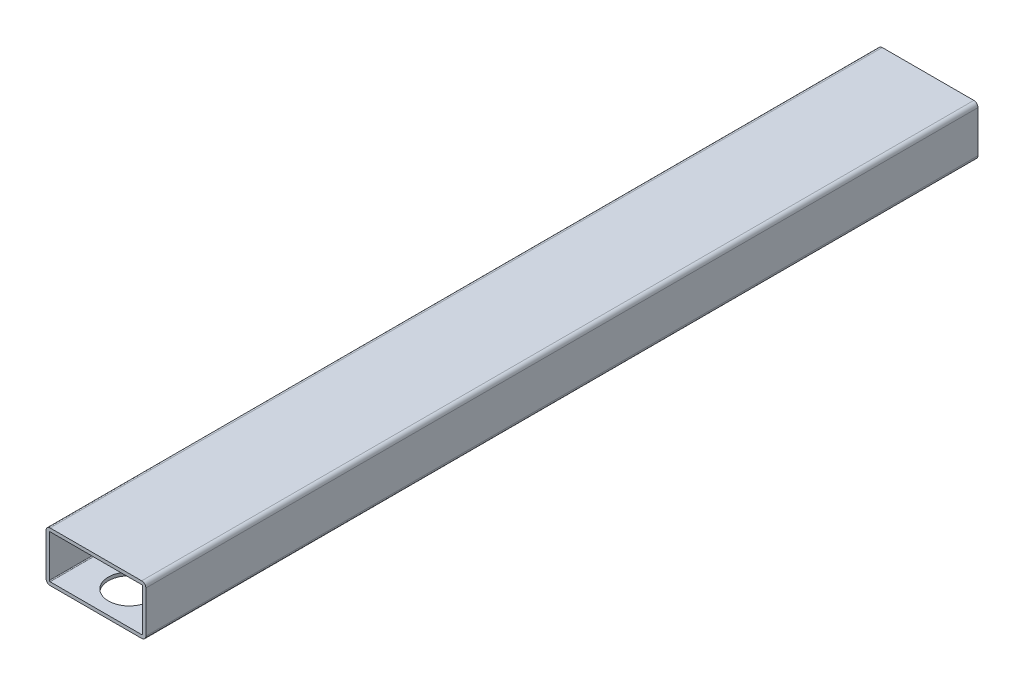
ISO-10303-21;
HEADER;
FILE_DESCRIPTION(('STEP AP214'),'2;1');
FILE_NAME('part.step','',(''),(''),'','','');
FILE_SCHEMA(('AUTOMOTIVE_DESIGN { 1 0 10303 214 1 1 1 1 }'));
ENDSEC;
DATA;
#1=APPLICATION_CONTEXT('core data for automotive mechanical design processes');
#2=APPLICATION_PROTOCOL_DEFINITION('international standard','automotive_design',2000,#1);
#3=PRODUCT_CONTEXT('',#1,'mechanical');
#4=PRODUCT('Part','Part','',(#3));
#5=PRODUCT_RELATED_PRODUCT_CATEGORY('part','',(#4));
#6=PRODUCT_DEFINITION_FORMATION('','',#4);
#7=PRODUCT_DEFINITION_CONTEXT('part definition',#1,'design');
#8=PRODUCT_DEFINITION('design','',#6,#7);
#9=PRODUCT_DEFINITION_SHAPE('','',#8);
#10=(LENGTH_UNIT() NAMED_UNIT(*) SI_UNIT(.MILLI.,.METRE.));
#11=(NAMED_UNIT(*) PLANE_ANGLE_UNIT() SI_UNIT($,.RADIAN.));
#12=(NAMED_UNIT(*) SI_UNIT($,.STERADIAN.) SOLID_ANGLE_UNIT());
#13=UNCERTAINTY_MEASURE_WITH_UNIT(LENGTH_MEASURE(1.E-05),#10,'distance_accuracy_value','');
#14=(GEOMETRIC_REPRESENTATION_CONTEXT(3) GLOBAL_UNCERTAINTY_ASSIGNED_CONTEXT((#13)) GLOBAL_UNIT_ASSIGNED_CONTEXT((#10,
#11,#12)) REPRESENTATION_CONTEXT('',''));
#15=CARTESIAN_POINT('',(0.,0.,0.));
#16=DIRECTION('',(0.,0.,1.));
#17=DIRECTION('',(1.,0.,0.));
#18=AXIS2_PLACEMENT_3D('',#15,#16,#17);
#19=CARTESIAN_POINT('',(55.,25.,1000.));
#20=DIRECTION('',(0.,0.,-1.));
#21=DIRECTION('',(-1.,0.,0.));
#22=AXIS2_PLACEMENT_3D('',#19,#20,#21);
#23=PLANE('',#22);
#24=CARTESIAN_POINT('',(55.,25.,1000.));
#25=DIRECTION('',(0.,0.,1.));
#26=DIRECTION('',(-1.,0.,0.));
#27=AXIS2_PLACEMENT_3D('',#24,#25,#26);
#28=CIRCLE('',#27,5.);
#29=CARTESIAN_POINT('',(60.,25.,1000.));
#30=VERTEX_POINT('',#29);
#31=CARTESIAN_POINT('',(55.,30.,1000.));
#32=VERTEX_POINT('',#31);
#33=EDGE_CURVE('E216',#30,#32,#28,.T.);
#34=ORIENTED_EDGE('',*,*,#33,.T.);
#35=DIRECTION('',(-1.,0.,0.));
#36=VECTOR('',#35,1.);
#37=CARTESIAN_POINT('',(-55.,30.,1000.));
#38=LINE('',#37,#36);
#39=CARTESIAN_POINT('',(-55.,30.,1000.));
#40=VERTEX_POINT('',#39);
#41=EDGE_CURVE('E219',#32,#40,#38,.T.);
#42=ORIENTED_EDGE('',*,*,#41,.T.);
#43=CARTESIAN_POINT('',(-55.,25.,1000.));
#44=DIRECTION('',(0.,0.,1.));
#45=DIRECTION('',(1.,0.,0.));
#46=AXIS2_PLACEMENT_3D('',#43,#44,#45);
#47=CIRCLE('',#46,5.);
#48=CARTESIAN_POINT('',(-60.,25.,1000.));
#49=VERTEX_POINT('',#48);
#50=EDGE_CURVE('E222',#40,#49,#47,.T.);
#51=ORIENTED_EDGE('',*,*,#50,.T.);
#52=DIRECTION('',(0.,-1.,0.));
#53=VECTOR('',#52,1.);
#54=CARTESIAN_POINT('',(-60.,25.,1000.));
#55=LINE('',#54,#53);
#56=CARTESIAN_POINT('',(-60.,-25.,1000.));
#57=VERTEX_POINT('',#56);
#58=EDGE_CURVE('E224',#49,#57,#55,.T.);
#59=ORIENTED_EDGE('',*,*,#58,.T.);
#60=CARTESIAN_POINT('',(-55.,-25.,1000.));
#61=DIRECTION('',(0.,0.,1.));
#62=DIRECTION('',(1.,0.,0.));
#63=AXIS2_PLACEMENT_3D('',#60,#61,#62);
#64=CIRCLE('',#63,5.);
#65=CARTESIAN_POINT('',(-55.,-30.,1000.));
#66=VERTEX_POINT('',#65);
#67=EDGE_CURVE('E226',#57,#66,#64,.T.);
#68=ORIENTED_EDGE('',*,*,#67,.T.);
#69=DIRECTION('',(1.,0.,0.));
#70=VECTOR('',#69,1.);
#71=CARTESIAN_POINT('',(-55.,-30.,1000.));
#72=LINE('',#71,#70);
#73=CARTESIAN_POINT('',(55.,-30.,1000.));
#74=VERTEX_POINT('',#73);
#75=EDGE_CURVE('E228',#66,#74,#72,.T.);
#76=ORIENTED_EDGE('',*,*,#75,.T.);
#77=CARTESIAN_POINT('',(55.,-25.,1000.));
#78=DIRECTION('',(0.,0.,1.));
#79=DIRECTION('',(1.,0.,0.));
#80=AXIS2_PLACEMENT_3D('',#77,#78,#79);
#81=CIRCLE('',#80,5.);
#82=CARTESIAN_POINT('',(60.,-25.,1000.));
#83=VERTEX_POINT('',#82);
#84=EDGE_CURVE('E230',#74,#83,#81,.T.);
#85=ORIENTED_EDGE('',*,*,#84,.T.);
#86=DIRECTION('',(0.,1.,0.));
#87=VECTOR('',#86,1.);
#88=CARTESIAN_POINT('',(60.,25.,1000.));
#89=LINE('',#88,#87);
#90=EDGE_CURVE('E232',#83,#30,#89,.T.);
#91=ORIENTED_EDGE('',*,*,#90,.T.);
#92=EDGE_LOOP('',(#34,#42,#51,#59,#68,#76,#85,#91));
#93=FACE_BOUND('',#92,.T.);
#94=CARTESIAN_POINT('',(-55.,25.,1000.));
#95=DIRECTION('',(0.,0.,1.));
#96=DIRECTION('',(1.,0.,0.));
#97=AXIS2_PLACEMENT_3D('',#94,#95,#96);
#98=CIRCLE('',#97,1.);
#99=CARTESIAN_POINT('',(-55.,26.,1000.));
#100=VERTEX_POINT('',#99);
#101=CARTESIAN_POINT('',(-56.,25.,1000.));
#102=VERTEX_POINT('',#101);
#103=EDGE_CURVE('E149',#100,#102,#98,.T.);
#104=ORIENTED_EDGE('',*,*,#103,.F.);
#105=DIRECTION('',(-1.,0.,0.));
#106=VECTOR('',#105,1.);
#107=CARTESIAN_POINT('',(-55.,26.,1000.));
#108=LINE('',#107,#106);
#109=CARTESIAN_POINT('',(55.,26.,1000.));
#110=VERTEX_POINT('',#109);
#111=EDGE_CURVE('E183',#110,#100,#108,.T.);
#112=ORIENTED_EDGE('',*,*,#111,.F.);
#113=CARTESIAN_POINT('',(55.,25.,1000.));
#114=DIRECTION('',(0.,0.,1.));
#115=DIRECTION('',(-1.,0.,0.));
#116=AXIS2_PLACEMENT_3D('',#113,#114,#115);
#117=CIRCLE('',#116,1.);
#118=CARTESIAN_POINT('',(56.,25.,1000.));
#119=VERTEX_POINT('',#118);
#120=EDGE_CURVE('E181',#119,#110,#117,.T.);
#121=ORIENTED_EDGE('',*,*,#120,.F.);
#122=DIRECTION('',(0.,1.,0.));
#123=VECTOR('',#122,1.);
#124=CARTESIAN_POINT('',(56.,25.,1000.));
#125=LINE('',#124,#123);
#126=CARTESIAN_POINT('',(56.,-25.,1000.));
#127=VERTEX_POINT('',#126);
#128=EDGE_CURVE('E179',#127,#119,#125,.T.);
#129=ORIENTED_EDGE('',*,*,#128,.F.);
#130=CARTESIAN_POINT('',(55.,-25.,1000.));
#131=DIRECTION('',(0.,0.,1.));
#132=DIRECTION('',(1.,0.,0.));
#133=AXIS2_PLACEMENT_3D('',#130,#131,#132);
#134=CIRCLE('',#133,0.999999999999997);
#135=CARTESIAN_POINT('',(55.,-26.,1000.));
#136=VERTEX_POINT('',#135);
#137=EDGE_CURVE('E177',#136,#127,#134,.T.);
#138=ORIENTED_EDGE('',*,*,#137,.F.);
#139=DIRECTION('',(1.,0.,0.));
#140=VECTOR('',#139,1.);
#141=CARTESIAN_POINT('',(-55.,-26.,1000.));
#142=LINE('',#141,#140);
#143=CARTESIAN_POINT('',(-55.,-26.,1000.));
#144=VERTEX_POINT('',#143);
#145=EDGE_CURVE('E172',#144,#136,#142,.T.);
#146=ORIENTED_EDGE('',*,*,#145,.F.);
#147=CARTESIAN_POINT('',(-55.,-25.,1000.));
#148=DIRECTION('',(0.,0.,1.));
#149=DIRECTION('',(1.,0.,0.));
#150=AXIS2_PLACEMENT_3D('',#147,#148,#149);
#151=CIRCLE('',#150,1.);
#152=CARTESIAN_POINT('',(-56.,-25.,1000.));
#153=VERTEX_POINT('',#152);
#154=EDGE_CURVE('E170',#153,#144,#151,.T.);
#155=ORIENTED_EDGE('',*,*,#154,.F.);
#156=DIRECTION('',(0.,-1.,0.));
#157=VECTOR('',#156,1.);
#158=CARTESIAN_POINT('',(-56.,25.,1000.));
#159=LINE('',#158,#157);
#160=EDGE_CURVE('E157',#102,#153,#159,.T.);
#161=ORIENTED_EDGE('',*,*,#160,.F.);
#162=EDGE_LOOP('',(#104,#112,#121,#129,#138,#146,#155,#161));
#163=FACE_BOUND('',#162,.T.);
#164=ADVANCED_FACE('F36',(#93,#163),#23,.F.);
#165=CARTESIAN_POINT('',(55.,25.,0.));
#166=DIRECTION('',(0.,0.,-1.));
#167=DIRECTION('',(-1.,0.,0.));
#168=AXIS2_PLACEMENT_3D('',#165,#166,#167);
#169=PLANE('',#168);
#170=CARTESIAN_POINT('',(55.,25.,0.));
#171=DIRECTION('',(0.,0.,1.));
#172=DIRECTION('',(-1.,0.,0.));
#173=AXIS2_PLACEMENT_3D('',#170,#171,#172);
#174=CIRCLE('',#173,5.);
#175=CARTESIAN_POINT('',(60.,25.,0.));
#176=VERTEX_POINT('',#175);
#177=CARTESIAN_POINT('',(55.,30.,0.));
#178=VERTEX_POINT('',#177);
#179=EDGE_CURVE('E165',#176,#178,#174,.T.);
#180=ORIENTED_EDGE('',*,*,#179,.F.);
#181=DIRECTION('',(0.,1.,0.));
#182=VECTOR('',#181,1.);
#183=CARTESIAN_POINT('',(60.,25.,0.));
#184=LINE('',#183,#182);
#185=CARTESIAN_POINT('',(60.,-25.,0.));
#186=VERTEX_POINT('',#185);
#187=EDGE_CURVE('E220',#186,#176,#184,.T.);
#188=ORIENTED_EDGE('',*,*,#187,.F.);
#189=CARTESIAN_POINT('',(55.,-25.,0.));
#190=DIRECTION('',(0.,0.,1.));
#191=DIRECTION('',(1.,0.,0.));
#192=AXIS2_PLACEMENT_3D('',#189,#190,#191);
#193=CIRCLE('',#192,5.);
#194=CARTESIAN_POINT('',(55.,-30.,0.));
#195=VERTEX_POINT('',#194);
#196=EDGE_CURVE('E247',#195,#186,#193,.T.);
#197=ORIENTED_EDGE('',*,*,#196,.F.);
#198=DIRECTION('',(1.,0.,0.));
#199=VECTOR('',#198,1.);
#200=CARTESIAN_POINT('',(-55.,-30.,0.));
#201=LINE('',#200,#199);
#202=CARTESIAN_POINT('',(-55.,-30.,0.));
#203=VERTEX_POINT('',#202);
#204=EDGE_CURVE('E245',#203,#195,#201,.T.);
#205=ORIENTED_EDGE('',*,*,#204,.F.);
#206=CARTESIAN_POINT('',(-55.,-25.,0.));
#207=DIRECTION('',(0.,0.,1.));
#208=DIRECTION('',(1.,0.,0.));
#209=AXIS2_PLACEMENT_3D('',#206,#207,#208);
#210=CIRCLE('',#209,5.);
#211=CARTESIAN_POINT('',(-60.,-25.,0.));
#212=VERTEX_POINT('',#211);
#213=EDGE_CURVE('E243',#212,#203,#210,.T.);
#214=ORIENTED_EDGE('',*,*,#213,.F.);
#215=DIRECTION('',(0.,-1.,0.));
#216=VECTOR('',#215,1.);
#217=CARTESIAN_POINT('',(-60.,25.,0.));
#218=LINE('',#217,#216);
#219=CARTESIAN_POINT('',(-60.,25.,0.));
#220=VERTEX_POINT('',#219);
#221=EDGE_CURVE('E241',#220,#212,#218,.T.);
#222=ORIENTED_EDGE('',*,*,#221,.F.);
#223=CARTESIAN_POINT('',(-55.,25.,0.));
#224=DIRECTION('',(0.,0.,1.));
#225=DIRECTION('',(1.,0.,0.));
#226=AXIS2_PLACEMENT_3D('',#223,#224,#225);
#227=CIRCLE('',#226,5.);
#228=CARTESIAN_POINT('',(-55.,30.,0.));
#229=VERTEX_POINT('',#228);
#230=EDGE_CURVE('E239',#229,#220,#227,.T.);
#231=ORIENTED_EDGE('',*,*,#230,.F.);
#232=DIRECTION('',(-1.,0.,0.));
#233=VECTOR('',#232,1.);
#234=CARTESIAN_POINT('',(-55.,30.,0.));
#235=LINE('',#234,#233);
#236=EDGE_CURVE('E237',#178,#229,#235,.T.);
#237=ORIENTED_EDGE('',*,*,#236,.F.);
#238=EDGE_LOOP('',(#180,#188,#197,#205,#214,#222,#231,#237));
#239=FACE_BOUND('',#238,.T.);
#240=DIRECTION('',(-1.,0.,0.));
#241=VECTOR('',#240,1.);
#242=CARTESIAN_POINT('',(-55.,26.,0.));
#243=LINE('',#242,#241);
#244=CARTESIAN_POINT('',(55.,26.,0.));
#245=VERTEX_POINT('',#244);
#246=CARTESIAN_POINT('',(-55.,26.,0.));
#247=VERTEX_POINT('',#246);
#248=EDGE_CURVE('E158',#245,#247,#243,.T.);
#249=ORIENTED_EDGE('',*,*,#248,.T.);
#250=CARTESIAN_POINT('',(-55.,25.,0.));
#251=DIRECTION('',(0.,0.,1.));
#252=DIRECTION('',(1.,0.,0.));
#253=AXIS2_PLACEMENT_3D('',#250,#251,#252);
#254=CIRCLE('',#253,1.);
#255=CARTESIAN_POINT('',(-56.,25.,0.));
#256=VERTEX_POINT('',#255);
#257=EDGE_CURVE('E59',#247,#256,#254,.T.);
#258=ORIENTED_EDGE('',*,*,#257,.T.);
#259=DIRECTION('',(0.,-1.,0.));
#260=VECTOR('',#259,1.);
#261=CARTESIAN_POINT('',(-56.,25.,0.));
#262=LINE('',#261,#260);
#263=CARTESIAN_POINT('',(-56.,-25.,0.));
#264=VERTEX_POINT('',#263);
#265=EDGE_CURVE('E164',#256,#264,#262,.T.);
#266=ORIENTED_EDGE('',*,*,#265,.T.);
#267=CARTESIAN_POINT('',(-55.,-25.,0.));
#268=DIRECTION('',(0.,0.,1.));
#269=DIRECTION('',(1.,0.,0.));
#270=AXIS2_PLACEMENT_3D('',#267,#268,#269);
#271=CIRCLE('',#270,1.);
#272=CARTESIAN_POINT('',(-55.,-26.,0.));
#273=VERTEX_POINT('',#272);
#274=EDGE_CURVE('E188',#264,#273,#271,.T.);
#275=ORIENTED_EDGE('',*,*,#274,.T.);
#276=DIRECTION('',(1.,0.,0.));
#277=VECTOR('',#276,1.);
#278=CARTESIAN_POINT('',(-55.,-26.,0.));
#279=LINE('',#278,#277);
#280=CARTESIAN_POINT('',(55.,-26.,0.));
#281=VERTEX_POINT('',#280);
#282=EDGE_CURVE('E191',#273,#281,#279,.T.);
#283=ORIENTED_EDGE('',*,*,#282,.T.);
#284=CARTESIAN_POINT('',(55.,-25.,0.));
#285=DIRECTION('',(0.,0.,1.));
#286=DIRECTION('',(1.,0.,0.));
#287=AXIS2_PLACEMENT_3D('',#284,#285,#286);
#288=CIRCLE('',#287,0.999999999999997);
#289=CARTESIAN_POINT('',(56.,-25.,0.));
#290=VERTEX_POINT('',#289);
#291=EDGE_CURVE('E194',#281,#290,#288,.T.);
#292=ORIENTED_EDGE('',*,*,#291,.T.);
#293=DIRECTION('',(0.,1.,0.));
#294=VECTOR('',#293,1.);
#295=CARTESIAN_POINT('',(56.,25.,0.));
#296=LINE('',#295,#294);
#297=CARTESIAN_POINT('',(56.,25.,0.));
#298=VERTEX_POINT('',#297);
#299=EDGE_CURVE('E197',#290,#298,#296,.T.);
#300=ORIENTED_EDGE('',*,*,#299,.T.);
#301=CARTESIAN_POINT('',(55.,25.,0.));
#302=DIRECTION('',(0.,0.,1.));
#303=DIRECTION('',(-1.,0.,0.));
#304=AXIS2_PLACEMENT_3D('',#301,#302,#303);
#305=CIRCLE('',#304,1.);
#306=EDGE_CURVE('E200',#298,#245,#305,.T.);
#307=ORIENTED_EDGE('',*,*,#306,.T.);
#308=EDGE_LOOP('',(#249,#258,#266,#275,#283,#292,#300,#307));
#309=FACE_BOUND('',#308,.T.);
#310=ADVANCED_FACE('F277',(#239,#309),#169,.T.);
#311=CARTESIAN_POINT('',(55.,25.,1000.));
#312=DIRECTION('',(0.,0.,-1.));
#313=DIRECTION('',(-1.,0.,0.));
#314=AXIS2_PLACEMENT_3D('',#311,#312,#313);
#315=CYLINDRICAL_SURFACE('',#314,5.);
#316=ORIENTED_EDGE('',*,*,#179,.T.);
#317=DIRECTION('',(0.,0.,-1.));
#318=VECTOR('',#317,1.);
#319=CARTESIAN_POINT('',(55.,30.,1000.));
#320=LINE('',#319,#318);
#321=EDGE_CURVE('E11',#32,#178,#320,.T.);
#322=ORIENTED_EDGE('',*,*,#321,.F.);
#323=ORIENTED_EDGE('',*,*,#33,.F.);
#324=DIRECTION('',(0.,0.,-1.));
#325=VECTOR('',#324,1.);
#326=CARTESIAN_POINT('',(60.,25.,1000.));
#327=LINE('',#326,#325);
#328=EDGE_CURVE('E234',#30,#176,#327,.T.);
#329=ORIENTED_EDGE('',*,*,#328,.T.);
#330=EDGE_LOOP('',(#316,#322,#323,#329));
#331=FACE_BOUND('',#330,.T.);
#332=ADVANCED_FACE('F38',(#331),#315,.T.);
#333=CARTESIAN_POINT('',(-55.,30.,1000.));
#334=DIRECTION('',(0.,-1.,0.));
#335=DIRECTION('',(0.,0.,-1.));
#336=AXIS2_PLACEMENT_3D('',#333,#334,#335);
#337=PLANE('',#336);
#338=ORIENTED_EDGE('',*,*,#236,.T.);
#339=DIRECTION('',(0.,0.,-1.));
#340=VECTOR('',#339,1.);
#341=CARTESIAN_POINT('',(-55.,30.,1000.));
#342=LINE('',#341,#340);
#343=EDGE_CURVE('E44',#40,#229,#342,.T.);
#344=ORIENTED_EDGE('',*,*,#343,.F.);
#345=ORIENTED_EDGE('',*,*,#41,.F.);
#346=ORIENTED_EDGE('',*,*,#321,.T.);
#347=EDGE_LOOP('',(#338,#344,#345,#346));
#348=FACE_BOUND('',#347,.T.);
#349=ADVANCED_FACE('F294',(#348),#337,.F.);
#350=CARTESIAN_POINT('',(-55.,25.,1000.));
#351=DIRECTION('',(0.,0.,-1.));
#352=DIRECTION('',(-1.,0.,0.));
#353=AXIS2_PLACEMENT_3D('',#350,#351,#352);
#354=CYLINDRICAL_SURFACE('',#353,5.);
#355=ORIENTED_EDGE('',*,*,#230,.T.);
#356=DIRECTION('',(0.,0.,-1.));
#357=VECTOR('',#356,1.);
#358=CARTESIAN_POINT('',(-60.,25.,1000.));
#359=LINE('',#358,#357);
#360=EDGE_CURVE('E264',#49,#220,#359,.T.);
#361=ORIENTED_EDGE('',*,*,#360,.F.);
#362=ORIENTED_EDGE('',*,*,#50,.F.);
#363=ORIENTED_EDGE('',*,*,#343,.T.);
#364=EDGE_LOOP('',(#355,#361,#362,#363));
#365=FACE_BOUND('',#364,.T.);
#366=ADVANCED_FACE('F271',(#365),#354,.T.);
#367=CARTESIAN_POINT('',(-60.,25.,1000.));
#368=DIRECTION('',(1.,0.,0.));
#369=DIRECTION('',(0.,1.,0.));
#370=AXIS2_PLACEMENT_3D('',#367,#368,#369);
#371=PLANE('',#370);
#372=ORIENTED_EDGE('',*,*,#221,.T.);
#373=DIRECTION('',(0.,0.,-1.));
#374=VECTOR('',#373,1.);
#375=CARTESIAN_POINT('',(-60.,-25.,1000.));
#376=LINE('',#375,#374);
#377=EDGE_CURVE('E261',#57,#212,#376,.T.);
#378=ORIENTED_EDGE('',*,*,#377,.F.);
#379=ORIENTED_EDGE('',*,*,#58,.F.);
#380=ORIENTED_EDGE('',*,*,#360,.T.);
#381=EDGE_LOOP('',(#372,#378,#379,#380));
#382=FACE_BOUND('',#381,.T.);
#383=ADVANCED_FACE('F283',(#382),#371,.F.);
#384=CARTESIAN_POINT('',(-55.,-25.,1000.));
#385=DIRECTION('',(0.,0.,-1.));
#386=DIRECTION('',(-1.,0.,0.));
#387=AXIS2_PLACEMENT_3D('',#384,#385,#386);
#388=CYLINDRICAL_SURFACE('',#387,5.);
#389=ORIENTED_EDGE('',*,*,#213,.T.);
#390=DIRECTION('',(0.,0.,-1.));
#391=VECTOR('',#390,1.);
#392=CARTESIAN_POINT('',(-55.,-30.,1000.));
#393=LINE('',#392,#391);
#394=EDGE_CURVE('E258',#66,#203,#393,.T.);
#395=ORIENTED_EDGE('',*,*,#394,.F.);
#396=ORIENTED_EDGE('',*,*,#67,.F.);
#397=ORIENTED_EDGE('',*,*,#377,.T.);
#398=EDGE_LOOP('',(#389,#395,#396,#397));
#399=FACE_BOUND('',#398,.T.);
#400=ADVANCED_FACE('F287',(#399),#388,.T.);
#401=CARTESIAN_POINT('',(-55.,-30.,1000.));
#402=DIRECTION('',(0.,1.,0.));
#403=DIRECTION('',(0.,0.,1.));
#404=AXIS2_PLACEMENT_3D('',#401,#402,#403);
#405=PLANE('',#404);
#406=CARTESIAN_POINT('',(0.,-30.,960.));
#407=DIRECTION('',(0.,-1.,0.));
#408=DIRECTION('',(0.,0.,-1.));
#409=AXIS2_PLACEMENT_3D('',#406,#407,#408);
#410=CIRCLE('',#409,25.);
#411=CARTESIAN_POINT('',(0.,-30.,935.));
#412=VERTEX_POINT('',#411);
#413=EDGE_CURVE('E186',#412,#412,#410,.T.);
#414=ORIENTED_EDGE('',*,*,#413,.F.);
#415=EDGE_LOOP('',(#414));
#416=FACE_BOUND('',#415,.T.);
#417=ORIENTED_EDGE('',*,*,#204,.T.);
#418=DIRECTION('',(0.,0.,-1.));
#419=VECTOR('',#418,1.);
#420=CARTESIAN_POINT('',(55.,-30.,1000.));
#421=LINE('',#420,#419);
#422=EDGE_CURVE('E255',#74,#195,#421,.T.);
#423=ORIENTED_EDGE('',*,*,#422,.F.);
#424=ORIENTED_EDGE('',*,*,#75,.F.);
#425=ORIENTED_EDGE('',*,*,#394,.T.);
#426=EDGE_LOOP('',(#417,#423,#424,#425));
#427=FACE_BOUND('',#426,.T.);
#428=ADVANCED_FACE('F307',(#416,#427),#405,.F.);
#429=CARTESIAN_POINT('',(55.,-25.,1000.));
#430=DIRECTION('',(0.,0.,-1.));
#431=DIRECTION('',(-1.,0.,0.));
#432=AXIS2_PLACEMENT_3D('',#429,#430,#431);
#433=CYLINDRICAL_SURFACE('',#432,5.);
#434=ORIENTED_EDGE('',*,*,#196,.T.);
#435=DIRECTION('',(0.,0.,-1.));
#436=VECTOR('',#435,1.);
#437=CARTESIAN_POINT('',(60.,-25.,1000.));
#438=LINE('',#437,#436);
#439=EDGE_CURVE('E252',#83,#186,#438,.T.);
#440=ORIENTED_EDGE('',*,*,#439,.F.);
#441=ORIENTED_EDGE('',*,*,#84,.F.);
#442=ORIENTED_EDGE('',*,*,#422,.T.);
#443=EDGE_LOOP('',(#434,#440,#441,#442));
#444=FACE_BOUND('',#443,.T.);
#445=ADVANCED_FACE('F305',(#444),#433,.T.);
#446=CARTESIAN_POINT('',(60.,25.,1000.));
#447=DIRECTION('',(-1.,0.,0.));
#448=DIRECTION('',(0.,-1.,0.));
#449=AXIS2_PLACEMENT_3D('',#446,#447,#448);
#450=PLANE('',#449);
#451=ORIENTED_EDGE('',*,*,#187,.T.);
#452=ORIENTED_EDGE('',*,*,#328,.F.);
#453=ORIENTED_EDGE('',*,*,#90,.F.);
#454=ORIENTED_EDGE('',*,*,#439,.T.);
#455=EDGE_LOOP('',(#451,#452,#453,#454));
#456=FACE_BOUND('',#455,.T.);
#457=ADVANCED_FACE('F300',(#456),#450,.F.);
#458=CARTESIAN_POINT('',(-55.,25.,1000.));
#459=DIRECTION('',(0.,0.,-1.));
#460=DIRECTION('',(-1.,0.,0.));
#461=AXIS2_PLACEMENT_3D('',#458,#459,#460);
#462=CYLINDRICAL_SURFACE('',#461,1.);
#463=ORIENTED_EDGE('',*,*,#257,.F.);
#464=DIRECTION('',(0.,0.,-1.));
#465=VECTOR('',#464,1.);
#466=CARTESIAN_POINT('',(-55.,26.,1000.));
#467=LINE('',#466,#465);
#468=EDGE_CURVE('E153',#100,#247,#467,.T.);
#469=ORIENTED_EDGE('',*,*,#468,.F.);
#470=ORIENTED_EDGE('',*,*,#103,.T.);
#471=DIRECTION('',(0.,0.,-1.));
#472=VECTOR('',#471,1.);
#473=CARTESIAN_POINT('',(-56.,25.,1000.));
#474=LINE('',#473,#472);
#475=EDGE_CURVE('E152',#102,#256,#474,.T.);
#476=ORIENTED_EDGE('',*,*,#475,.T.);
#477=EDGE_LOOP('',(#463,#469,#470,#476));
#478=FACE_BOUND('',#477,.T.);
#479=ADVANCED_FACE('F151',(#478),#462,.F.);
#480=CARTESIAN_POINT('',(-56.,25.,1000.));
#481=DIRECTION('',(1.,0.,0.));
#482=DIRECTION('',(0.,1.,0.));
#483=AXIS2_PLACEMENT_3D('',#480,#481,#482);
#484=PLANE('',#483);
#485=ORIENTED_EDGE('',*,*,#265,.F.);
#486=ORIENTED_EDGE('',*,*,#475,.F.);
#487=ORIENTED_EDGE('',*,*,#160,.T.);
#488=DIRECTION('',(0.,0.,-1.));
#489=VECTOR('',#488,1.);
#490=CARTESIAN_POINT('',(-56.,-25.,1000.));
#491=LINE('',#490,#489);
#492=EDGE_CURVE('E166',#153,#264,#491,.T.);
#493=ORIENTED_EDGE('',*,*,#492,.T.);
#494=EDGE_LOOP('',(#485,#486,#487,#493));
#495=FACE_BOUND('',#494,.T.);
#496=ADVANCED_FACE('F161',(#495),#484,.T.);
#497=CARTESIAN_POINT('',(-55.,-25.,1000.));
#498=DIRECTION('',(0.,0.,-1.));
#499=DIRECTION('',(-1.,0.,0.));
#500=AXIS2_PLACEMENT_3D('',#497,#498,#499);
#501=CYLINDRICAL_SURFACE('',#500,1.);
#502=ORIENTED_EDGE('',*,*,#274,.F.);
#503=ORIENTED_EDGE('',*,*,#492,.F.);
#504=ORIENTED_EDGE('',*,*,#154,.T.);
#505=DIRECTION('',(0.,0.,-1.));
#506=VECTOR('',#505,1.);
#507=CARTESIAN_POINT('',(-55.,-26.,1000.));
#508=LINE('',#507,#506);
#509=EDGE_CURVE('E213',#144,#273,#508,.T.);
#510=ORIENTED_EDGE('',*,*,#509,.T.);
#511=EDGE_LOOP('',(#502,#503,#504,#510));
#512=FACE_BOUND('',#511,.T.);
#513=ADVANCED_FACE('F334',(#512),#501,.F.);
#514=CARTESIAN_POINT('',(-55.,-26.,1000.));
#515=DIRECTION('',(0.,1.,0.));
#516=DIRECTION('',(0.,0.,1.));
#517=AXIS2_PLACEMENT_3D('',#514,#515,#516);
#518=PLANE('',#517);
#519=CARTESIAN_POINT('',(0.,-26.,960.));
#520=DIRECTION('',(0.,1.,0.));
#521=DIRECTION('',(0.,0.,1.));
#522=AXIS2_PLACEMENT_3D('',#519,#520,#521);
#523=CIRCLE('',#522,25.);
#524=CARTESIAN_POINT('',(0.,-26.,985.));
#525=VERTEX_POINT('',#524);
#526=EDGE_CURVE('E368',#525,#525,#523,.F.);
#527=ORIENTED_EDGE('',*,*,#526,.T.);
#528=EDGE_LOOP('',(#527));
#529=FACE_BOUND('',#528,.T.);
#530=ORIENTED_EDGE('',*,*,#282,.F.);
#531=ORIENTED_EDGE('',*,*,#509,.F.);
#532=ORIENTED_EDGE('',*,*,#145,.T.);
#533=DIRECTION('',(0.,0.,-1.));
#534=VECTOR('',#533,1.);
#535=CARTESIAN_POINT('',(55.,-26.,1000.));
#536=LINE('',#535,#534);
#537=EDGE_CURVE('E211',#136,#281,#536,.T.);
#538=ORIENTED_EDGE('',*,*,#537,.T.);
#539=EDGE_LOOP('',(#530,#531,#532,#538));
#540=FACE_BOUND('',#539,.T.);
#541=ADVANCED_FACE('F338',(#529,#540),#518,.T.);
#542=CARTESIAN_POINT('',(55.,-25.,1000.));
#543=DIRECTION('',(0.,0.,-1.));
#544=DIRECTION('',(-1.,0.,0.));
#545=AXIS2_PLACEMENT_3D('',#542,#543,#544);
#546=CYLINDRICAL_SURFACE('',#545,0.999999999999997);
#547=ORIENTED_EDGE('',*,*,#291,.F.);
#548=ORIENTED_EDGE('',*,*,#537,.F.);
#549=ORIENTED_EDGE('',*,*,#137,.T.);
#550=DIRECTION('',(0.,0.,-1.));
#551=VECTOR('',#550,1.);
#552=CARTESIAN_POINT('',(56.,-25.,1000.));
#553=LINE('',#552,#551);
#554=EDGE_CURVE('E209',#127,#290,#553,.T.);
#555=ORIENTED_EDGE('',*,*,#554,.T.);
#556=EDGE_LOOP('',(#547,#548,#549,#555));
#557=FACE_BOUND('',#556,.T.);
#558=ADVANCED_FACE('F344',(#557),#546,.F.);
#559=CARTESIAN_POINT('',(56.,25.,1000.));
#560=DIRECTION('',(-1.,0.,0.));
#561=DIRECTION('',(0.,0.,1.));
#562=AXIS2_PLACEMENT_3D('',#559,#560,#561);
#563=PLANE('',#562);
#564=ORIENTED_EDGE('',*,*,#299,.F.);
#565=ORIENTED_EDGE('',*,*,#554,.F.);
#566=ORIENTED_EDGE('',*,*,#128,.T.);
#567=DIRECTION('',(0.,0.,-1.));
#568=VECTOR('',#567,1.);
#569=CARTESIAN_POINT('',(56.,25.,1000.));
#570=LINE('',#569,#568);
#571=EDGE_CURVE('E207',#119,#298,#570,.T.);
#572=ORIENTED_EDGE('',*,*,#571,.T.);
#573=EDGE_LOOP('',(#564,#565,#566,#572));
#574=FACE_BOUND('',#573,.T.);
#575=ADVANCED_FACE('F348',(#574),#563,.T.);
#576=CARTESIAN_POINT('',(55.,25.,1000.));
#577=DIRECTION('',(0.,0.,-1.));
#578=DIRECTION('',(-1.,0.,0.));
#579=AXIS2_PLACEMENT_3D('',#576,#577,#578);
#580=CYLINDRICAL_SURFACE('',#579,1.);
#581=ORIENTED_EDGE('',*,*,#306,.F.);
#582=ORIENTED_EDGE('',*,*,#571,.F.);
#583=ORIENTED_EDGE('',*,*,#120,.T.);
#584=DIRECTION('',(0.,0.,-1.));
#585=VECTOR('',#584,1.);
#586=CARTESIAN_POINT('',(55.,26.,1000.));
#587=LINE('',#586,#585);
#588=EDGE_CURVE('E51',#110,#245,#587,.T.);
#589=ORIENTED_EDGE('',*,*,#588,.T.);
#590=EDGE_LOOP('',(#581,#582,#583,#589));
#591=FACE_BOUND('',#590,.T.);
#592=ADVANCED_FACE('F352',(#591),#580,.F.);
#593=CARTESIAN_POINT('',(-55.,26.,1000.));
#594=DIRECTION('',(0.,-1.,0.));
#595=DIRECTION('',(0.,0.,-1.));
#596=AXIS2_PLACEMENT_3D('',#593,#594,#595);
#597=PLANE('',#596);
#598=ORIENTED_EDGE('',*,*,#248,.F.);
#599=ORIENTED_EDGE('',*,*,#588,.F.);
#600=ORIENTED_EDGE('',*,*,#111,.T.);
#601=ORIENTED_EDGE('',*,*,#468,.T.);
#602=EDGE_LOOP('',(#598,#599,#600,#601));
#603=FACE_BOUND('',#602,.T.);
#604=ADVANCED_FACE('F356',(#603),#597,.T.);
#605=CARTESIAN_POINT('',(0.,30.001,960.));
#606=DIRECTION('',(0.,-1.,0.));
#607=DIRECTION('',(0.,0.,-1.));
#608=AXIS2_PLACEMENT_3D('',#605,#606,#607);
#609=CYLINDRICAL_SURFACE('',#608,25.);
#610=ORIENTED_EDGE('',*,*,#526,.F.);
#611=EDGE_LOOP('',(#610));
#612=FACE_BOUND('',#611,.T.);
#613=ORIENTED_EDGE('',*,*,#413,.T.);
#614=EDGE_LOOP('',(#613));
#615=FACE_BOUND('',#614,.T.);
#616=ADVANCED_FACE('F360',(#612,#615),#609,.F.);
#617=CLOSED_SHELL('',(#164,#310,#332,#349,#366,#383,#400,#428,#445,#457,#479,#496,#513,#541,
#558,#575,#592,#604,#616));
#618=MANIFOLD_SOLID_BREP('B2',#617);
#619=ADVANCED_BREP_SHAPE_REPRESENTATION('',(#18,#618),#14);
#620=SHAPE_DEFINITION_REPRESENTATION(#9,#619);
ENDSEC;
END-ISO-10303-21;
